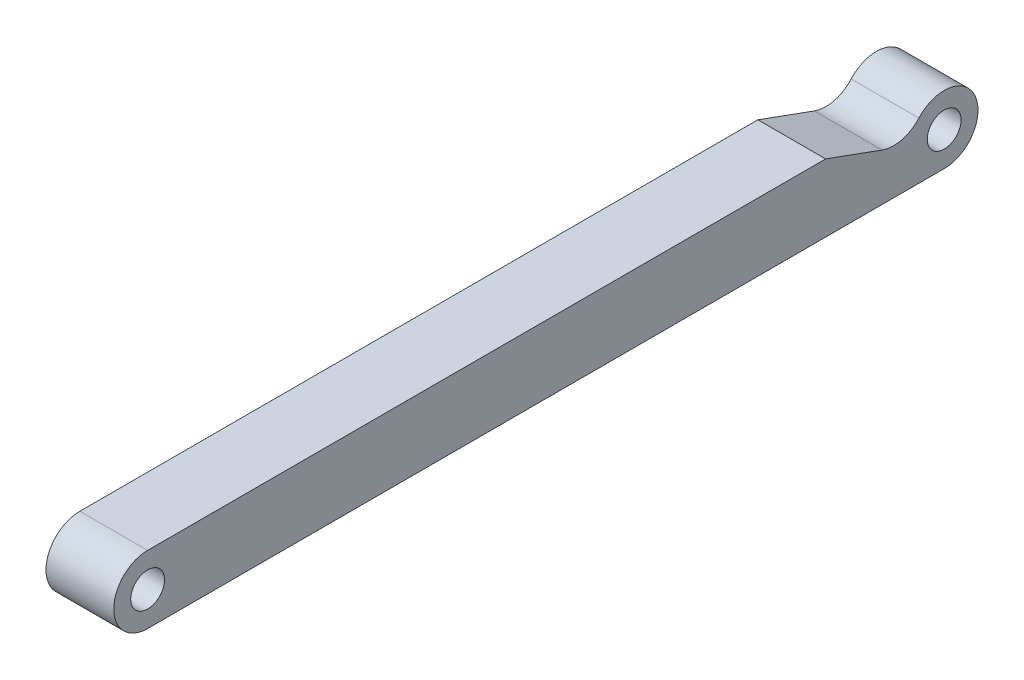
ISO-10303-21;
HEADER;
FILE_DESCRIPTION(('STEP AP214'),'2;1');
FILE_NAME('part.step','',(''),(''),'','','');
FILE_SCHEMA(('AUTOMOTIVE_DESIGN { 1 0 10303 214 1 1 1 1 }'));
ENDSEC;
DATA;
#1=APPLICATION_CONTEXT('core data for automotive mechanical design processes');
#2=APPLICATION_PROTOCOL_DEFINITION('international standard','automotive_design',2000,#1);
#3=PRODUCT_CONTEXT('',#1,'mechanical');
#4=PRODUCT('Part','Part','',(#3));
#5=PRODUCT_RELATED_PRODUCT_CATEGORY('part','',(#4));
#6=PRODUCT_DEFINITION_FORMATION('','',#4);
#7=PRODUCT_DEFINITION_CONTEXT('part definition',#1,'design');
#8=PRODUCT_DEFINITION('design','',#6,#7);
#9=PRODUCT_DEFINITION_SHAPE('','',#8);
#10=(LENGTH_UNIT() NAMED_UNIT(*) SI_UNIT(.MILLI.,.METRE.));
#11=(NAMED_UNIT(*) PLANE_ANGLE_UNIT() SI_UNIT($,.RADIAN.));
#12=(NAMED_UNIT(*) SI_UNIT($,.STERADIAN.) SOLID_ANGLE_UNIT());
#13=UNCERTAINTY_MEASURE_WITH_UNIT(LENGTH_MEASURE(1.E-05),#10,'distance_accuracy_value','');
#14=(GEOMETRIC_REPRESENTATION_CONTEXT(3) GLOBAL_UNCERTAINTY_ASSIGNED_CONTEXT((#13)) GLOBAL_UNIT_ASSIGNED_CONTEXT((#10,
#11,#12)) REPRESENTATION_CONTEXT('',''));
#15=CARTESIAN_POINT('',(0.,0.,0.));
#16=DIRECTION('',(0.,0.,1.));
#17=DIRECTION('',(1.,0.,0.));
#18=AXIS2_PLACEMENT_3D('',#15,#16,#17);
#19=CARTESIAN_POINT('',(-2.,-0.162479586942259,0.153639897585327));
#20=DIRECTION('',(1.,0.,0.));
#21=DIRECTION('',(0.,0.,-1.));
#22=AXIS2_PLACEMENT_3D('',#19,#20,#21);
#23=CYLINDRICAL_SURFACE('',#22,2.);
#24=DIRECTION('',(1.,0.,0.));
#25=VECTOR('',#24,1.);
#26=CARTESIAN_POINT('',(-2.,-2.04186482851408,0.837680184236665));
#27=LINE('',#26,#25);
#28=CARTESIAN_POINT('',(-2.,-2.04186482851408,0.837680184236665));
#29=VERTEX_POINT('',#28);
#30=CARTESIAN_POINT('',(2.,-2.04186482851408,0.837680184236665));
#31=VERTEX_POINT('',#30);
#32=EDGE_CURVE('E41',#29,#31,#27,.T.);
#33=ORIENTED_EDGE('',*,*,#32,.T.);
#34=CARTESIAN_POINT('',(2.,-0.162479586942259,0.153639897585327));
#35=DIRECTION('',(1.,0.,0.));
#36=DIRECTION('',(0.,0.,-1.));
#37=AXIS2_PLACEMENT_3D('',#34,#35,#36);
#38=CIRCLE('',#37,2.);
#39=CARTESIAN_POINT('',(2.,-1.49545335584422,-1.33739361358043));
#40=VERTEX_POINT('',#39);
#41=EDGE_CURVE('E94',#31,#40,#38,.T.);
#42=ORIENTED_EDGE('',*,*,#41,.T.);
#43=DIRECTION('',(1.,0.,0.));
#44=VECTOR('',#43,1.);
#45=CARTESIAN_POINT('',(-2.,-1.49545335584422,-1.33739361358043));
#46=LINE('',#45,#44);
#47=CARTESIAN_POINT('',(-2.,-1.49545335584422,-1.33739361358043));
#48=VERTEX_POINT('',#47);
#49=EDGE_CURVE('E11',#48,#40,#46,.T.);
#50=ORIENTED_EDGE('',*,*,#49,.F.);
#51=CARTESIAN_POINT('',(-2.,-0.162479586942259,0.153639897585327));
#52=DIRECTION('',(1.,0.,0.));
#53=DIRECTION('',(0.,0.,-1.));
#54=AXIS2_PLACEMENT_3D('',#51,#52,#53);
#55=CIRCLE('',#54,2.);
#56=EDGE_CURVE('E54',#29,#48,#55,.T.);
#57=ORIENTED_EDGE('',*,*,#56,.F.);
#58=EDGE_LOOP('',(#33,#42,#50,#57));
#59=FACE_BOUND('',#58,.T.);
#60=ADVANCED_FACE('F38',(#59),#23,.F.);
#61=CARTESIAN_POINT('',(-2.,-2.82842712474618,-2.8284271247462));
#62=DIRECTION('',(1.,0.,0.));
#63=DIRECTION('',(0.,0.,-1.));
#64=AXIS2_PLACEMENT_3D('',#61,#62,#63);
#65=CYLINDRICAL_SURFACE('',#64,2.);
#66=ORIENTED_EDGE('',*,*,#49,.T.);
#67=CARTESIAN_POINT('',(2.,-2.82842712474618,-2.8284271247462));
#68=DIRECTION('',(1.,0.,0.));
#69=DIRECTION('',(0.,0.,-1.));
#70=AXIS2_PLACEMENT_3D('',#67,#68,#69);
#71=CIRCLE('',#70,2.);
#72=CARTESIAN_POINT('',(2.,-4.82842712474618,-2.8284271247462));
#73=VERTEX_POINT('',#72);
#74=EDGE_CURVE('E111',#73,#40,#71,.T.);
#75=ORIENTED_EDGE('',*,*,#74,.F.);
#76=DIRECTION('',(1.,0.,0.));
#77=VECTOR('',#76,1.);
#78=CARTESIAN_POINT('',(-2.,-4.82842712474618,-2.8284271247462));
#79=LINE('',#78,#77);
#80=CARTESIAN_POINT('',(-2.,-4.82842712474618,-2.8284271247462));
#81=VERTEX_POINT('',#80);
#82=EDGE_CURVE('E46',#81,#73,#79,.T.);
#83=ORIENTED_EDGE('',*,*,#82,.F.);
#84=CARTESIAN_POINT('',(-2.,-2.82842712474618,-2.8284271247462));
#85=DIRECTION('',(1.,0.,0.));
#86=DIRECTION('',(0.,0.,-1.));
#87=AXIS2_PLACEMENT_3D('',#84,#85,#86);
#88=CIRCLE('',#87,2.);
#89=EDGE_CURVE('E139',#81,#48,#88,.T.);
#90=ORIENTED_EDGE('',*,*,#89,.T.);
#91=EDGE_LOOP('',(#66,#75,#83,#90));
#92=FACE_BOUND('',#91,.T.);
#93=ADVANCED_FACE('F160',(#92),#65,.T.);
#94=CARTESIAN_POINT('',(-2.,-4.82842712474619,0.));
#95=DIRECTION('',(0.,1.,0.));
#96=DIRECTION('',(0.,0.,1.));
#97=AXIS2_PLACEMENT_3D('',#94,#95,#96);
#98=PLANE('',#97);
#99=ORIENTED_EDGE('',*,*,#82,.T.);
#100=DIRECTION('',(0.,0.,1.));
#101=VECTOR('',#100,1.);
#102=CARTESIAN_POINT('',(2.,-4.82842712474619,0.));
#103=LINE('',#102,#101);
#104=CARTESIAN_POINT('',(2.,-4.8284271247462,44.2031609568309));
#105=VERTEX_POINT('',#104);
#106=EDGE_CURVE('E118',#73,#105,#103,.T.);
#107=ORIENTED_EDGE('',*,*,#106,.T.);
#108=DIRECTION('',(1.,0.,0.));
#109=VECTOR('',#108,1.);
#110=CARTESIAN_POINT('',(-2.,-4.8284271247462,44.2031609568309));
#111=LINE('',#110,#109);
#112=CARTESIAN_POINT('',(-2.,-4.8284271247462,44.2031609568309));
#113=VERTEX_POINT('',#112);
#114=EDGE_CURVE('E147',#113,#105,#111,.T.);
#115=ORIENTED_EDGE('',*,*,#114,.F.);
#116=DIRECTION('',(0.,0.,1.));
#117=VECTOR('',#116,1.);
#118=CARTESIAN_POINT('',(-2.,-4.82842712474619,0.));
#119=LINE('',#118,#117);
#120=EDGE_CURVE('E137',#81,#113,#119,.T.);
#121=ORIENTED_EDGE('',*,*,#120,.F.);
#122=EDGE_LOOP('',(#99,#107,#115,#121));
#123=FACE_BOUND('',#122,.T.);
#124=ADVANCED_FACE('F159',(#123),#98,.F.);
#125=CARTESIAN_POINT('',(-2.,-2.82842712474621,44.2031609568309));
#126=DIRECTION('',(1.,0.,0.));
#127=DIRECTION('',(0.,0.,-1.));
#128=AXIS2_PLACEMENT_3D('',#125,#126,#127);
#129=CYLINDRICAL_SURFACE('',#128,2.);
#130=ORIENTED_EDGE('',*,*,#114,.T.);
#131=CARTESIAN_POINT('',(2.,-2.82842712474621,44.2031609568309));
#132=DIRECTION('',(1.,0.,0.));
#133=DIRECTION('',(0.,0.,-1.));
#134=AXIS2_PLACEMENT_3D('',#131,#132,#133);
#135=CIRCLE('',#134,2.);
#136=CARTESIAN_POINT('',(2.,-0.828427124746205,44.2031609568309));
#137=VERTEX_POINT('',#136);
#138=EDGE_CURVE('E115',#137,#105,#135,.T.);
#139=ORIENTED_EDGE('',*,*,#138,.F.);
#140=DIRECTION('',(1.,0.,0.));
#141=VECTOR('',#140,1.);
#142=CARTESIAN_POINT('',(-2.,-0.828427124746205,44.2031609568309));
#143=LINE('',#142,#141);
#144=CARTESIAN_POINT('',(-2.,-0.828427124746205,44.2031609568309));
#145=VERTEX_POINT('',#144);
#146=EDGE_CURVE('E149',#145,#137,#143,.T.);
#147=ORIENTED_EDGE('',*,*,#146,.F.);
#148=CARTESIAN_POINT('',(-2.,-2.82842712474621,44.2031609568309));
#149=DIRECTION('',(1.,0.,0.));
#150=DIRECTION('',(0.,0.,-1.));
#151=AXIS2_PLACEMENT_3D('',#148,#149,#150);
#152=CIRCLE('',#151,2.);
#153=EDGE_CURVE('E134',#145,#113,#152,.T.);
#154=ORIENTED_EDGE('',*,*,#153,.T.);
#155=EDGE_LOOP('',(#130,#139,#147,#154));
#156=FACE_BOUND('',#155,.T.);
#157=ADVANCED_FACE('F156',(#156),#129,.T.);
#158=CARTESIAN_POINT('',(-2.,-0.828427124746184,0.));
#159=DIRECTION('',(0.,1.,0.));
#160=DIRECTION('',(0.,0.,1.));
#161=AXIS2_PLACEMENT_3D('',#158,#159,#160);
#162=PLANE('',#161);
#163=ORIENTED_EDGE('',*,*,#146,.T.);
#164=DIRECTION('',(0.,0.,1.));
#165=VECTOR('',#164,1.);
#166=CARTESIAN_POINT('',(2.,-0.828427124746184,0.));
#167=LINE('',#166,#165);
#168=CARTESIAN_POINT('',(2.,-0.828427124746186,4.17157287525381));
#169=VERTEX_POINT('',#168);
#170=EDGE_CURVE('E105',#169,#137,#167,.T.);
#171=ORIENTED_EDGE('',*,*,#170,.F.);
#172=DIRECTION('',(1.,0.,0.));
#173=VECTOR('',#172,1.);
#174=CARTESIAN_POINT('',(-2.,-0.828427124746186,4.17157287525381));
#175=LINE('',#174,#173);
#176=CARTESIAN_POINT('',(-2.,-0.828427124746186,4.17157287525381));
#177=VERTEX_POINT('',#176);
#178=EDGE_CURVE('E97',#177,#169,#175,.T.);
#179=ORIENTED_EDGE('',*,*,#178,.F.);
#180=DIRECTION('',(0.,0.,1.));
#181=VECTOR('',#180,1.);
#182=CARTESIAN_POINT('',(-2.,-0.828427124746184,0.));
#183=LINE('',#182,#181);
#184=EDGE_CURVE('E131',#177,#145,#183,.T.);
#185=ORIENTED_EDGE('',*,*,#184,.T.);
#186=EDGE_LOOP('',(#163,#171,#179,#185));
#187=FACE_BOUND('',#186,.T.);
#188=ADVANCED_FACE('F151',(#187),#162,.T.);
#189=CARTESIAN_POINT('',(-2.,-2.82842712474618,-2.8284271247462));
#190=DIRECTION('',(1.,0.,0.));
#191=DIRECTION('',(0.,0.,-1.));
#192=AXIS2_PLACEMENT_3D('',#189,#190,#191);
#193=CYLINDRICAL_SURFACE('',#192,1.);
#194=CARTESIAN_POINT('',(-2.,-2.82842712474618,-2.8284271247462));
#195=DIRECTION('',(1.,0.,0.));
#196=DIRECTION('',(0.,0.,-1.));
#197=AXIS2_PLACEMENT_3D('',#194,#195,#196);
#198=CIRCLE('',#197,1.);
#199=CARTESIAN_POINT('',(-2.,-2.82842712474618,-3.8284271247462));
#200=VERTEX_POINT('',#199);
#201=EDGE_CURVE('E141',#200,#200,#198,.T.);
#202=ORIENTED_EDGE('',*,*,#201,.F.);
#203=EDGE_LOOP('',(#202));
#204=FACE_BOUND('',#203,.T.);
#205=CARTESIAN_POINT('',(2.,-2.82842712474618,-2.8284271247462));
#206=DIRECTION('',(1.,0.,0.));
#207=DIRECTION('',(0.,0.,-1.));
#208=AXIS2_PLACEMENT_3D('',#205,#206,#207);
#209=CIRCLE('',#208,1.);
#210=CARTESIAN_POINT('',(2.,-2.82842712474618,-3.8284271247462));
#211=VERTEX_POINT('',#210);
#212=EDGE_CURVE('E122',#211,#211,#209,.T.);
#213=ORIENTED_EDGE('',*,*,#212,.T.);
#214=EDGE_LOOP('',(#213));
#215=FACE_BOUND('',#214,.T.);
#216=ADVANCED_FACE('F189',(#204,#215),#193,.F.);
#217=CARTESIAN_POINT('',(-2.,-2.07223723865232,0.754232673207433));
#218=DIRECTION('',(0.,0.939692620785908,-0.342020143325669));
#219=DIRECTION('',(0.,0.342020143325669,0.939692620785908));
#220=AXIS2_PLACEMENT_3D('',#217,#218,#219);
#221=PLANE('',#220);
#222=ORIENTED_EDGE('',*,*,#178,.T.);
#223=DIRECTION('',(0.,0.342020143325669,0.939692620785908));
#224=VECTOR('',#223,1.);
#225=CARTESIAN_POINT('',(2.,-2.07223723865232,0.754232673207433));
#226=LINE('',#225,#224);
#227=EDGE_CURVE('E100',#31,#169,#226,.T.);
#228=ORIENTED_EDGE('',*,*,#227,.F.);
#229=ORIENTED_EDGE('',*,*,#32,.F.);
#230=DIRECTION('',(0.,0.342020143325669,0.939692620785908));
#231=VECTOR('',#230,1.);
#232=CARTESIAN_POINT('',(-2.,-2.07223723865232,0.754232673207433));
#233=LINE('',#232,#231);
#234=EDGE_CURVE('E129',#29,#177,#233,.T.);
#235=ORIENTED_EDGE('',*,*,#234,.T.);
#236=EDGE_LOOP('',(#222,#228,#229,#235));
#237=FACE_BOUND('',#236,.T.);
#238=ADVANCED_FACE('F101',(#237),#221,.T.);
#239=CARTESIAN_POINT('',(-2.,-2.82842712474621,44.2031609568309));
#240=DIRECTION('',(1.,0.,0.));
#241=DIRECTION('',(0.,0.,-1.));
#242=AXIS2_PLACEMENT_3D('',#239,#240,#241);
#243=CYLINDRICAL_SURFACE('',#242,0.999999999999984);
#244=CARTESIAN_POINT('',(-2.,-2.82842712474621,44.2031609568309));
#245=DIRECTION('',(1.,0.,0.));
#246=DIRECTION('',(0.,0.,-1.));
#247=AXIS2_PLACEMENT_3D('',#244,#245,#246);
#248=CIRCLE('',#247,0.999999999999984);
#249=CARTESIAN_POINT('',(-2.,-2.82842712474621,43.2031609568309));
#250=VERTEX_POINT('',#249);
#251=EDGE_CURVE('E98',#250,#250,#248,.T.);
#252=ORIENTED_EDGE('',*,*,#251,.F.);
#253=EDGE_LOOP('',(#252));
#254=FACE_BOUND('',#253,.T.);
#255=CARTESIAN_POINT('',(2.,-2.82842712474621,44.2031609568309));
#256=DIRECTION('',(1.,0.,0.));
#257=DIRECTION('',(0.,0.,-1.));
#258=AXIS2_PLACEMENT_3D('',#255,#256,#257);
#259=CIRCLE('',#258,0.999999999999984);
#260=CARTESIAN_POINT('',(2.,-2.82842712474621,43.2031609568309));
#261=VERTEX_POINT('',#260);
#262=EDGE_CURVE('E125',#261,#261,#259,.T.);
#263=ORIENTED_EDGE('',*,*,#262,.T.);
#264=EDGE_LOOP('',(#263));
#265=FACE_BOUND('',#264,.T.);
#266=ADVANCED_FACE('F164',(#254,#265),#243,.F.);
#267=CARTESIAN_POINT('',(-2.,0.,0.));
#268=DIRECTION('',(1.,0.,0.));
#269=DIRECTION('',(0.,0.,-1.));
#270=AXIS2_PLACEMENT_3D('',#267,#268,#269);
#271=PLANE('',#270);
#272=ORIENTED_EDGE('',*,*,#56,.T.);
#273=ORIENTED_EDGE('',*,*,#89,.F.);
#274=ORIENTED_EDGE('',*,*,#120,.T.);
#275=ORIENTED_EDGE('',*,*,#153,.F.);
#276=ORIENTED_EDGE('',*,*,#184,.F.);
#277=ORIENTED_EDGE('',*,*,#234,.F.);
#278=EDGE_LOOP('',(#272,#273,#274,#275,#276,#277));
#279=FACE_BOUND('',#278,.T.);
#280=ORIENTED_EDGE('',*,*,#201,.T.);
#281=EDGE_LOOP('',(#280));
#282=FACE_BOUND('',#281,.T.);
#283=ORIENTED_EDGE('',*,*,#251,.T.);
#284=EDGE_LOOP('',(#283));
#285=FACE_BOUND('',#284,.T.);
#286=ADVANCED_FACE('F161',(#279,#282,#285),#271,.F.);
#287=CARTESIAN_POINT('',(2.,0.,0.));
#288=DIRECTION('',(1.,0.,0.));
#289=DIRECTION('',(0.,0.,-1.));
#290=AXIS2_PLACEMENT_3D('',#287,#288,#289);
#291=PLANE('',#290);
#292=ORIENTED_EDGE('',*,*,#41,.F.);
#293=ORIENTED_EDGE('',*,*,#227,.T.);
#294=ORIENTED_EDGE('',*,*,#170,.T.);
#295=ORIENTED_EDGE('',*,*,#138,.T.);
#296=ORIENTED_EDGE('',*,*,#106,.F.);
#297=ORIENTED_EDGE('',*,*,#74,.T.);
#298=EDGE_LOOP('',(#292,#293,#294,#295,#296,#297));
#299=FACE_BOUND('',#298,.T.);
#300=ORIENTED_EDGE('',*,*,#212,.F.);
#301=EDGE_LOOP('',(#300));
#302=FACE_BOUND('',#301,.T.);
#303=ORIENTED_EDGE('',*,*,#262,.F.);
#304=EDGE_LOOP('',(#303));
#305=FACE_BOUND('',#304,.T.);
#306=ADVANCED_FACE('F108',(#299,#302,#305),#291,.T.);
#307=CLOSED_SHELL('',(#60,#93,#124,#157,#188,#216,#238,#266,#286,#306));
#308=MANIFOLD_SOLID_BREP('B2',#307);
#309=ADVANCED_BREP_SHAPE_REPRESENTATION('',(#18,#308),#14);
#310=SHAPE_DEFINITION_REPRESENTATION(#9,#309);
ENDSEC;
END-ISO-10303-21;
